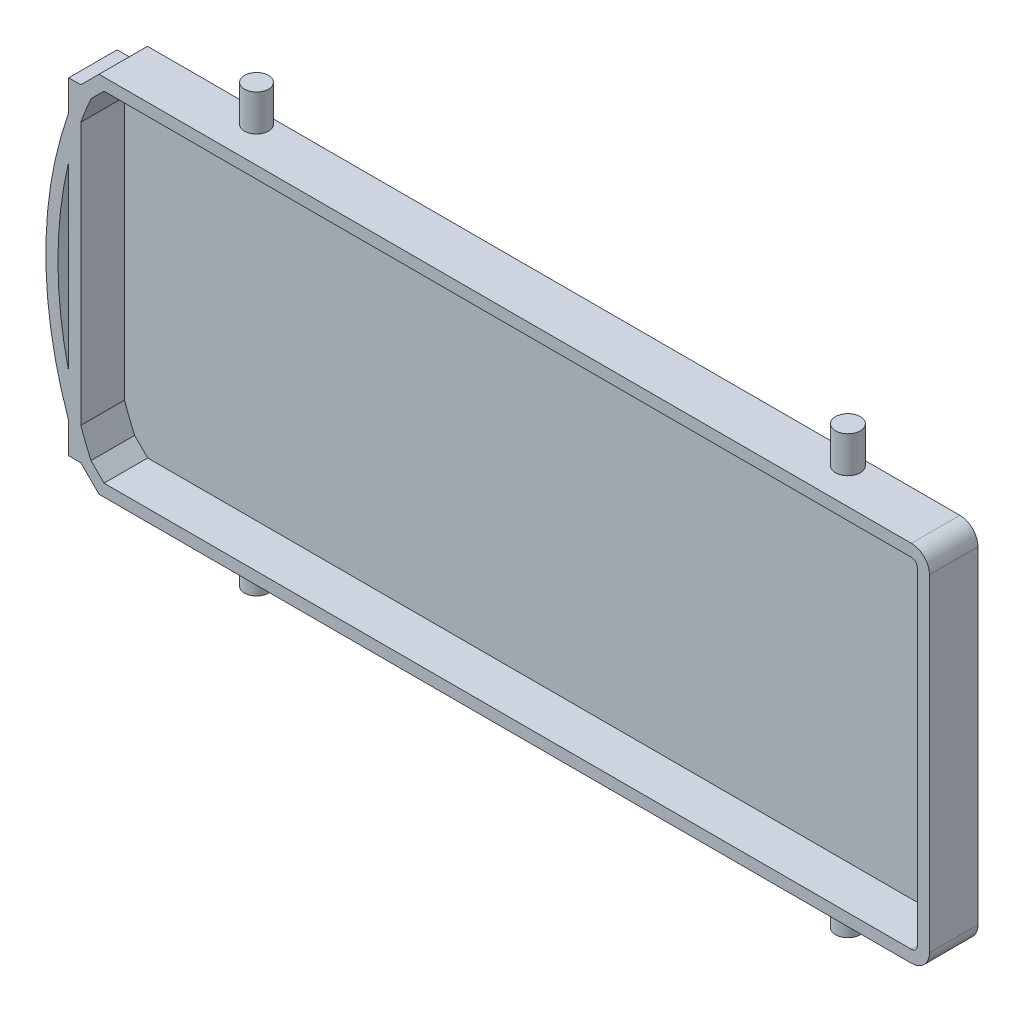
ISO-10303-21;
HEADER;
FILE_DESCRIPTION(('STEP AP214'),'2;1');
FILE_NAME('part.step','',(''),(''),'','','');
FILE_SCHEMA(('AUTOMOTIVE_DESIGN { 1 0 10303 214 1 1 1 1 }'));
ENDSEC;
DATA;
#1=APPLICATION_CONTEXT('core data for automotive mechanical design processes');
#2=APPLICATION_PROTOCOL_DEFINITION('international standard','automotive_design',2000,#1);
#3=PRODUCT_CONTEXT('',#1,'mechanical');
#4=PRODUCT('Part','Part','',(#3));
#5=PRODUCT_RELATED_PRODUCT_CATEGORY('part','',(#4));
#6=PRODUCT_DEFINITION_FORMATION('','',#4);
#7=PRODUCT_DEFINITION_CONTEXT('part definition',#1,'design');
#8=PRODUCT_DEFINITION('design','',#6,#7);
#9=PRODUCT_DEFINITION_SHAPE('','',#8);
#10=(LENGTH_UNIT() NAMED_UNIT(*) SI_UNIT(.MILLI.,.METRE.));
#11=(NAMED_UNIT(*) PLANE_ANGLE_UNIT() SI_UNIT($,.RADIAN.));
#12=(NAMED_UNIT(*) SI_UNIT($,.STERADIAN.) SOLID_ANGLE_UNIT());
#13=UNCERTAINTY_MEASURE_WITH_UNIT(LENGTH_MEASURE(1.E-05),#10,'distance_accuracy_value','');
#14=(GEOMETRIC_REPRESENTATION_CONTEXT(3) GLOBAL_UNCERTAINTY_ASSIGNED_CONTEXT((#13)) GLOBAL_UNIT_ASSIGNED_CONTEXT((#10,
#11,#12)) REPRESENTATION_CONTEXT('',''));
#15=CARTESIAN_POINT('',(0.,0.,0.));
#16=DIRECTION('',(0.,0.,1.));
#17=DIRECTION('',(1.,0.,0.));
#18=AXIS2_PLACEMENT_3D('',#15,#16,#17);
#19=CARTESIAN_POINT('',(-48.8771015017287,0.,40.));
#20=DIRECTION('',(0.,0.,-1.));
#21=DIRECTION('',(-1.,0.,0.));
#22=AXIS2_PLACEMENT_3D('',#19,#20,#21);
#23=CYLINDRICAL_SURFACE('',#22,320.);
#24=DIRECTION('',(0.,0.,-1.));
#25=VECTOR('',#24,1.);
#26=CARTESIAN_POINT('',(-350.,108.282039138538,40.));
#27=LINE('',#26,#25);
#28=CARTESIAN_POINT('',(-350.,108.282039138538,4.));
#29=VERTEX_POINT('',#28);
#30=CARTESIAN_POINT('',(-350.,108.282039138538,40.));
#31=VERTEX_POINT('',#30);
#32=EDGE_CURVE('E342',#29,#31,#27,.F.);
#33=ORIENTED_EDGE('',*,*,#32,.F.);
#34=CARTESIAN_POINT('',(-48.8771015017287,0.,4.));
#35=DIRECTION('',(0.,0.,1.));
#36=DIRECTION('',(1.,0.,0.));
#37=AXIS2_PLACEMENT_3D('',#34,#35,#36);
#38=CIRCLE('',#37,320.);
#39=CARTESIAN_POINT('',(-341.617461171138,129.24040320513,4.));
#40=VERTEX_POINT('',#39);
#41=EDGE_CURVE('E329',#29,#40,#38,.F.);
#42=ORIENTED_EDGE('',*,*,#41,.T.);
#43=DIRECTION('',(0.,0.,-1.));
#44=VECTOR('',#43,1.);
#45=CARTESIAN_POINT('',(-341.617461171139,129.24040320513,40.));
#46=LINE('',#45,#44);
#47=CARTESIAN_POINT('',(-341.617461171139,129.24040320513,40.));
#48=VERTEX_POINT('',#47);
#49=EDGE_CURVE('E192',#48,#40,#46,.T.);
#50=ORIENTED_EDGE('',*,*,#49,.F.);
#51=CARTESIAN_POINT('',(-48.8771015017287,0.,40.));
#52=DIRECTION('',(0.,0.,1.));
#53=DIRECTION('',(1.,0.,0.));
#54=AXIS2_PLACEMENT_3D('',#51,#52,#53);
#55=CIRCLE('',#54,320.);
#56=EDGE_CURVE('E346',#31,#48,#55,.F.);
#57=ORIENTED_EDGE('',*,*,#56,.F.);
#58=EDGE_LOOP('',(#33,#42,#50,#57));
#59=FACE_BOUND('',#58,.T.);
#60=ADVANCED_FACE('F167',(#59),#23,.F.);
#61=CARTESIAN_POINT('',(-234.331213423204,140.,10.7496274782667));
#62=DIRECTION('',(0.,1.,0.));
#63=DIRECTION('',(0.,0.,1.));
#64=AXIS2_PLACEMENT_3D('',#61,#62,#63);
#65=PLANE('',#64);
#66=DIRECTION('',(0.,0.,-1.));
#67=VECTOR('',#66,1.);
#68=CARTESIAN_POINT('',(-330.857864376269,140.,40.));
#69=LINE('',#68,#67);
#70=CARTESIAN_POINT('',(-330.857864376269,140.,40.));
#71=VERTEX_POINT('',#70);
#72=CARTESIAN_POINT('',(-330.857864376269,140.,4.));
#73=VERTEX_POINT('',#72);
#74=EDGE_CURVE('E423',#71,#73,#69,.T.);
#75=ORIENTED_EDGE('',*,*,#74,.T.);
#76=DIRECTION('',(1.,0.,0.));
#77=VECTOR('',#76,1.);
#78=CARTESIAN_POINT('',(-234.331213423204,140.,4.));
#79=LINE('',#78,#77);
#80=CARTESIAN_POINT('',(335.,140.,4.));
#81=VERTEX_POINT('',#80);
#82=EDGE_CURVE('E184',#73,#81,#79,.T.);
#83=ORIENTED_EDGE('',*,*,#82,.T.);
#84=DIRECTION('',(0.,0.,-1.));
#85=VECTOR('',#84,1.);
#86=CARTESIAN_POINT('',(335.,140.,40.));
#87=LINE('',#86,#85);
#88=CARTESIAN_POINT('',(335.,140.,40.));
#89=VERTEX_POINT('',#88);
#90=EDGE_CURVE('E490',#89,#81,#87,.T.);
#91=ORIENTED_EDGE('',*,*,#90,.F.);
#92=DIRECTION('',(1.,0.,0.));
#93=VECTOR('',#92,1.);
#94=CARTESIAN_POINT('',(-335.,140.,40.));
#95=LINE('',#94,#93);
#96=EDGE_CURVE('E457',#71,#89,#95,.T.);
#97=ORIENTED_EDGE('',*,*,#96,.F.);
#98=EDGE_LOOP('',(#75,#83,#91,#97));
#99=FACE_BOUND('',#98,.T.);
#100=ADVANCED_FACE('F606',(#99),#65,.F.);
#101=CARTESIAN_POINT('',(-234.331213423204,180.,10.7496274782667));
#102=DIRECTION('',(0.,-1.,0.));
#103=DIRECTION('',(0.,0.,-1.));
#104=AXIS2_PLACEMENT_3D('',#101,#102,#103);
#105=CYLINDRICAL_SURFACE('',#104,9.87493762328161);
#106=CARTESIAN_POINT('',(-234.331213423204,150.,10.7496274782667));
#107=DIRECTION('',(0.,1.,0.));
#108=DIRECTION('',(0.,0.,1.));
#109=AXIS2_PLACEMENT_3D('',#106,#107,#108);
#110=CIRCLE('',#109,9.87493762328161);
#111=CARTESIAN_POINT('',(-234.331213423204,150.,20.6245651015483));
#112=VERTEX_POINT('',#111);
#113=EDGE_CURVE('E171',#112,#112,#110,.T.);
#114=ORIENTED_EDGE('',*,*,#113,.T.);
#115=EDGE_LOOP('',(#114));
#116=FACE_BOUND('',#115,.T.);
#117=CARTESIAN_POINT('',(-234.331213423204,180.,10.7496274782667));
#118=DIRECTION('',(0.,1.,0.));
#119=DIRECTION('',(0.,0.,1.));
#120=AXIS2_PLACEMENT_3D('',#117,#118,#119);
#121=CIRCLE('',#120,9.87493762328161);
#122=CARTESIAN_POINT('',(-234.331213423204,180.,20.6245651015483));
#123=VERTEX_POINT('',#122);
#124=EDGE_CURVE('E367',#123,#123,#121,.T.);
#125=ORIENTED_EDGE('',*,*,#124,.F.);
#126=EDGE_LOOP('',(#125));
#127=FACE_BOUND('',#126,.T.);
#128=ADVANCED_FACE('F169',(#116,#127),#105,.T.);
#129=CARTESIAN_POINT('',(-234.331213423204,180.,10.7496274782667));
#130=DIRECTION('',(0.,1.,0.));
#131=DIRECTION('',(0.,0.,1.));
#132=AXIS2_PLACEMENT_3D('',#129,#130,#131);
#133=PLANE('',#132);
#134=ORIENTED_EDGE('',*,*,#124,.T.);
#135=EDGE_LOOP('',(#134));
#136=FACE_BOUND('',#135,.T.);
#137=ADVANCED_FACE('F722',(#136),#133,.T.);
#138=CARTESIAN_POINT('',(335.,-135.,0.));
#139=DIRECTION('',(0.,0.,-1.));
#140=DIRECTION('',(-1.,0.,0.));
#141=AXIS2_PLACEMENT_3D('',#138,#139,#140);
#142=PLANE('',#141);
#143=DIRECTION('',(-0.707106781186548,0.707106781186547,0.));
#144=VECTOR('',#143,1.);
#145=CARTESIAN_POINT('',(-350.,-135.,0.));
#146=LINE('',#145,#144);
#147=CARTESIAN_POINT('',(-335.,-150.,0.));
#148=VERTEX_POINT('',#147);
#149=CARTESIAN_POINT('',(-350.,-135.,0.));
#150=VERTEX_POINT('',#149);
#151=EDGE_CURVE('E363',#148,#150,#146,.T.);
#152=ORIENTED_EDGE('',*,*,#151,.T.);
#153=DIRECTION('',(-1.,0.,0.));
#154=VECTOR('',#153,1.);
#155=CARTESIAN_POINT('',(-350.,-135.,0.));
#156=LINE('',#155,#154);
#157=CARTESIAN_POINT('',(-360.,-135.,0.));
#158=VERTEX_POINT('',#157);
#159=EDGE_CURVE('E520',#150,#158,#156,.T.);
#160=ORIENTED_EDGE('',*,*,#159,.T.);
#161=DIRECTION('',(0.,-1.,0.));
#162=VECTOR('',#161,1.);
#163=CARTESIAN_POINT('',(-360.,135.,0.));
#164=LINE('',#163,#162);
#165=CARTESIAN_POINT('',(-360.,-110.011554075173,0.));
#166=VERTEX_POINT('',#165);
#167=EDGE_CURVE('E522',#166,#158,#164,.T.);
#168=ORIENTED_EDGE('',*,*,#167,.F.);
#169=CARTESIAN_POINT('',(-48.8771015017287,0.,0.));
#170=DIRECTION('',(0.,0.,-1.));
#171=DIRECTION('',(-1.,0.,0.));
#172=AXIS2_PLACEMENT_3D('',#169,#170,#171);
#173=CIRCLE('',#172,330.);
#174=CARTESIAN_POINT('',(-360.,110.011554075172,0.));
#175=VERTEX_POINT('',#174);
#176=EDGE_CURVE('E536',#166,#175,#173,.T.);
#177=ORIENTED_EDGE('',*,*,#176,.T.);
#178=CARTESIAN_POINT('',(-360.,135.,0.));
#179=VERTEX_POINT('',#178);
#180=EDGE_CURVE('E517',#179,#175,#164,.T.);
#181=ORIENTED_EDGE('',*,*,#180,.F.);
#182=DIRECTION('',(1.,0.,0.));
#183=VECTOR('',#182,1.);
#184=CARTESIAN_POINT('',(-360.,135.,0.));
#185=LINE('',#184,#183);
#186=CARTESIAN_POINT('',(-350.,135.,0.));
#187=VERTEX_POINT('',#186);
#188=EDGE_CURVE('E410',#179,#187,#185,.T.);
#189=ORIENTED_EDGE('',*,*,#188,.T.);
#190=DIRECTION('',(0.707106781186548,0.707106781186547,0.));
#191=VECTOR('',#190,1.);
#192=CARTESIAN_POINT('',(-350.,135.,0.));
#193=LINE('',#192,#191);
#194=CARTESIAN_POINT('',(-335.,150.,0.));
#195=VERTEX_POINT('',#194);
#196=EDGE_CURVE('E404',#187,#195,#193,.T.);
#197=ORIENTED_EDGE('',*,*,#196,.T.);
#198=DIRECTION('',(1.,0.,0.));
#199=VECTOR('',#198,1.);
#200=CARTESIAN_POINT('',(-335.,150.,0.));
#201=LINE('',#200,#199);
#202=CARTESIAN_POINT('',(335.,150.,0.));
#203=VERTEX_POINT('',#202);
#204=EDGE_CURVE('E390',#195,#203,#201,.T.);
#205=ORIENTED_EDGE('',*,*,#204,.T.);
#206=CARTESIAN_POINT('',(335.,135.,0.));
#207=DIRECTION('',(0.,0.,-1.));
#208=DIRECTION('',(-1.,0.,0.));
#209=AXIS2_PLACEMENT_3D('',#206,#207,#208);
#210=CIRCLE('',#209,15.);
#211=CARTESIAN_POINT('',(350.,135.,0.));
#212=VERTEX_POINT('',#211);
#213=EDGE_CURVE('E400',#203,#212,#210,.T.);
#214=ORIENTED_EDGE('',*,*,#213,.T.);
#215=DIRECTION('',(0.,-1.,0.));
#216=VECTOR('',#215,1.);
#217=CARTESIAN_POINT('',(350.,135.,0.));
#218=LINE('',#217,#216);
#219=CARTESIAN_POINT('',(350.,-135.,0.));
#220=VERTEX_POINT('',#219);
#221=EDGE_CURVE('E475',#212,#220,#218,.T.);
#222=ORIENTED_EDGE('',*,*,#221,.T.);
#223=CARTESIAN_POINT('',(335.,-135.,0.));
#224=DIRECTION('',(0.,0.,-1.));
#225=DIRECTION('',(1.,0.,0.));
#226=AXIS2_PLACEMENT_3D('',#223,#224,#225);
#227=CIRCLE('',#226,15.);
#228=CARTESIAN_POINT('',(335.,-150.,0.));
#229=VERTEX_POINT('',#228);
#230=EDGE_CURVE('E472',#220,#229,#227,.T.);
#231=ORIENTED_EDGE('',*,*,#230,.T.);
#232=DIRECTION('',(-1.,0.,0.));
#233=VECTOR('',#232,1.);
#234=CARTESIAN_POINT('',(-335.,-150.,0.));
#235=LINE('',#234,#233);
#236=EDGE_CURVE('E469',#229,#148,#235,.T.);
#237=ORIENTED_EDGE('',*,*,#236,.T.);
#238=EDGE_LOOP('',(#152,#160,#168,#177,#181,#189,#197,#205,#214,#222,#231,#237));
#239=FACE_BOUND('',#238,.T.);
#240=CARTESIAN_POINT('',(-48.8771015017287,0.,0.));
#241=DIRECTION('',(0.,0.,1.));
#242=DIRECTION('',(1.,0.,0.));
#243=AXIS2_PLACEMENT_3D('',#240,#241,#242);
#244=CIRCLE('',#243,320.);
#245=CARTESIAN_POINT('',(-360.,-74.8501304610392,0.));
#246=VERTEX_POINT('',#245);
#247=CARTESIAN_POINT('',(-360.,74.8501304610388,0.));
#248=VERTEX_POINT('',#247);
#249=EDGE_CURVE('E437',#246,#248,#244,.F.);
#250=ORIENTED_EDGE('',*,*,#249,.F.);
#251=EDGE_CURVE('E521',#248,#246,#164,.T.);
#252=ORIENTED_EDGE('',*,*,#251,.F.);
#253=EDGE_LOOP('',(#250,#252));
#254=FACE_BOUND('',#253,.T.);
#255=ADVANCED_FACE('F406',(#239,#254),#142,.T.);
#256=CARTESIAN_POINT('',(335.,-135.,40.));
#257=DIRECTION('',(0.,0.,-1.));
#258=DIRECTION('',(-1.,0.,0.));
#259=AXIS2_PLACEMENT_3D('',#256,#257,#258);
#260=PLANE('',#259);
#261=DIRECTION('',(-0.707106781186548,0.707106781186547,0.));
#262=VECTOR('',#261,1.);
#263=CARTESIAN_POINT('',(-342.928932188134,-127.928932188134,40.));
#264=LINE('',#263,#262);
#265=CARTESIAN_POINT('',(-330.857864376269,-140.,40.));
#266=VERTEX_POINT('',#265);
#267=CARTESIAN_POINT('',(-341.617461171139,-129.24040320513,40.));
#268=VERTEX_POINT('',#267);
#269=EDGE_CURVE('E399',#266,#268,#264,.T.);
#270=ORIENTED_EDGE('',*,*,#269,.T.);
#271=CARTESIAN_POINT('',(-350.,-108.282039138539,40.));
#272=VERTEX_POINT('',#271);
#273=EDGE_CURVE('E528',#268,#272,#55,.F.);
#274=ORIENTED_EDGE('',*,*,#273,.T.);
#275=DIRECTION('',(0.,-1.,0.));
#276=VECTOR('',#275,1.);
#277=CARTESIAN_POINT('',(-350.,135.,40.));
#278=LINE('',#277,#276);
#279=EDGE_CURVE('E512',#31,#272,#278,.T.);
#280=ORIENTED_EDGE('',*,*,#279,.F.);
#281=ORIENTED_EDGE('',*,*,#56,.T.);
#282=DIRECTION('',(0.707106781186548,0.707106781186547,0.));
#283=VECTOR('',#282,1.);
#284=CARTESIAN_POINT('',(-342.928932188135,127.928932188134,40.));
#285=LINE('',#284,#283);
#286=EDGE_CURVE('E417',#48,#71,#285,.T.);
#287=ORIENTED_EDGE('',*,*,#286,.T.);
#288=ORIENTED_EDGE('',*,*,#96,.T.);
#289=CARTESIAN_POINT('',(335.,135.,40.));
#290=DIRECTION('',(0.,0.,1.));
#291=DIRECTION('',(1.,0.,0.));
#292=AXIS2_PLACEMENT_3D('',#289,#290,#291);
#293=CIRCLE('',#292,5.);
#294=CARTESIAN_POINT('',(340.,135.,40.));
#295=VERTEX_POINT('',#294);
#296=EDGE_CURVE('E459',#89,#295,#293,.F.);
#297=ORIENTED_EDGE('',*,*,#296,.T.);
#298=DIRECTION('',(0.,-1.,0.));
#299=VECTOR('',#298,1.);
#300=CARTESIAN_POINT('',(340.,135.,40.));
#301=LINE('',#300,#299);
#302=CARTESIAN_POINT('',(340.,-135.,40.));
#303=VERTEX_POINT('',#302);
#304=EDGE_CURVE('E461',#295,#303,#301,.T.);
#305=ORIENTED_EDGE('',*,*,#304,.T.);
#306=CARTESIAN_POINT('',(335.,-135.,40.));
#307=DIRECTION('',(0.,0.,1.));
#308=DIRECTION('',(1.,0.,0.));
#309=AXIS2_PLACEMENT_3D('',#306,#307,#308);
#310=CIRCLE('',#309,5.);
#311=CARTESIAN_POINT('',(335.,-140.,40.));
#312=VERTEX_POINT('',#311);
#313=EDGE_CURVE('E463',#303,#312,#310,.F.);
#314=ORIENTED_EDGE('',*,*,#313,.T.);
#315=DIRECTION('',(1.,0.,0.));
#316=VECTOR('',#315,1.);
#317=CARTESIAN_POINT('',(-335.,-140.,40.));
#318=LINE('',#317,#316);
#319=EDGE_CURVE('E465',#312,#266,#318,.F.);
#320=ORIENTED_EDGE('',*,*,#319,.T.);
#321=EDGE_LOOP('',(#270,#274,#280,#281,#287,#288,#297,#305,#314,#320));
#322=FACE_BOUND('',#321,.T.);
#323=DIRECTION('',(0.707106781186548,0.707106781186547,0.));
#324=VECTOR('',#323,1.);
#325=CARTESIAN_POINT('',(-350.,135.,40.));
#326=LINE('',#325,#324);
#327=CARTESIAN_POINT('',(-350.,135.,40.));
#328=VERTEX_POINT('',#327);
#329=CARTESIAN_POINT('',(-335.,150.,40.));
#330=VERTEX_POINT('',#329);
#331=EDGE_CURVE('E413',#328,#330,#326,.T.);
#332=ORIENTED_EDGE('',*,*,#331,.F.);
#333=DIRECTION('',(1.,0.,0.));
#334=VECTOR('',#333,1.);
#335=CARTESIAN_POINT('',(-360.,135.,40.));
#336=LINE('',#335,#334);
#337=CARTESIAN_POINT('',(-360.,135.,40.));
#338=VERTEX_POINT('',#337);
#339=EDGE_CURVE('E514',#338,#328,#336,.T.);
#340=ORIENTED_EDGE('',*,*,#339,.F.);
#341=DIRECTION('',(0.,-1.,0.));
#342=VECTOR('',#341,1.);
#343=CARTESIAN_POINT('',(-360.,135.,40.));
#344=LINE('',#343,#342);
#345=CARTESIAN_POINT('',(-360.,110.011554075172,40.));
#346=VERTEX_POINT('',#345);
#347=EDGE_CURVE('E504',#338,#346,#344,.T.);
#348=ORIENTED_EDGE('',*,*,#347,.T.);
#349=CARTESIAN_POINT('',(-48.8771015017287,0.,40.));
#350=DIRECTION('',(0.,0.,-1.));
#351=DIRECTION('',(-1.,0.,0.));
#352=AXIS2_PLACEMENT_3D('',#349,#350,#351);
#353=CIRCLE('',#352,330.);
#354=CARTESIAN_POINT('',(-360.,-110.011554075173,40.));
#355=VERTEX_POINT('',#354);
#356=EDGE_CURVE('E530',#355,#346,#353,.T.);
#357=ORIENTED_EDGE('',*,*,#356,.F.);
#358=CARTESIAN_POINT('',(-360.,-135.,40.));
#359=VERTEX_POINT('',#358);
#360=EDGE_CURVE('E509',#355,#359,#344,.T.);
#361=ORIENTED_EDGE('',*,*,#360,.T.);
#362=DIRECTION('',(-1.,0.,0.));
#363=VECTOR('',#362,1.);
#364=CARTESIAN_POINT('',(-350.,-135.,40.));
#365=LINE('',#364,#363);
#366=CARTESIAN_POINT('',(-350.,-135.,40.));
#367=VERTEX_POINT('',#366);
#368=EDGE_CURVE('E507',#367,#359,#365,.T.);
#369=ORIENTED_EDGE('',*,*,#368,.F.);
#370=DIRECTION('',(-0.707106781186548,0.707106781186547,0.));
#371=VECTOR('',#370,1.);
#372=CARTESIAN_POINT('',(-350.,-135.,40.));
#373=LINE('',#372,#371);
#374=CARTESIAN_POINT('',(-335.,-150.,40.));
#375=VERTEX_POINT('',#374);
#376=EDGE_CURVE('E440',#375,#367,#373,.T.);
#377=ORIENTED_EDGE('',*,*,#376,.F.);
#378=DIRECTION('',(-1.,0.,0.));
#379=VECTOR('',#378,1.);
#380=CARTESIAN_POINT('',(-335.,-150.,40.));
#381=LINE('',#380,#379);
#382=CARTESIAN_POINT('',(335.,-150.,40.));
#383=VERTEX_POINT('',#382);
#384=EDGE_CURVE('E443',#383,#375,#381,.T.);
#385=ORIENTED_EDGE('',*,*,#384,.F.);
#386=CARTESIAN_POINT('',(335.,-135.,40.));
#387=DIRECTION('',(0.,0.,-1.));
#388=DIRECTION('',(1.,0.,0.));
#389=AXIS2_PLACEMENT_3D('',#386,#387,#388);
#390=CIRCLE('',#389,15.);
#391=CARTESIAN_POINT('',(350.,-135.,40.));
#392=VERTEX_POINT('',#391);
#393=EDGE_CURVE('E446',#392,#383,#390,.T.);
#394=ORIENTED_EDGE('',*,*,#393,.F.);
#395=DIRECTION('',(0.,-1.,0.));
#396=VECTOR('',#395,1.);
#397=CARTESIAN_POINT('',(350.,135.,40.));
#398=LINE('',#397,#396);
#399=CARTESIAN_POINT('',(350.,135.,40.));
#400=VERTEX_POINT('',#399);
#401=EDGE_CURVE('E449',#400,#392,#398,.T.);
#402=ORIENTED_EDGE('',*,*,#401,.F.);
#403=CARTESIAN_POINT('',(335.,135.,40.));
#404=DIRECTION('',(0.,0.,-1.));
#405=DIRECTION('',(-1.,0.,0.));
#406=AXIS2_PLACEMENT_3D('',#403,#404,#405);
#407=CIRCLE('',#406,15.);
#408=CARTESIAN_POINT('',(335.,150.,40.));
#409=VERTEX_POINT('',#408);
#410=EDGE_CURVE('E452',#409,#400,#407,.T.);
#411=ORIENTED_EDGE('',*,*,#410,.F.);
#412=DIRECTION('',(1.,0.,0.));
#413=VECTOR('',#412,1.);
#414=CARTESIAN_POINT('',(-335.,150.,40.));
#415=LINE('',#414,#413);
#416=EDGE_CURVE('E455',#330,#409,#415,.T.);
#417=ORIENTED_EDGE('',*,*,#416,.F.);
#418=EDGE_LOOP('',(#332,#340,#348,#357,#361,#369,#377,#385,#394,#402,#411,#417));
#419=FACE_BOUND('',#418,.T.);
#420=CARTESIAN_POINT('',(-360.,74.8501304610388,40.));
#421=VERTEX_POINT('',#420);
#422=CARTESIAN_POINT('',(-360.,-74.8501304610392,40.));
#423=VERTEX_POINT('',#422);
#424=EDGE_CURVE('E508',#421,#423,#344,.T.);
#425=ORIENTED_EDGE('',*,*,#424,.T.);
#426=EDGE_CURVE('E531',#423,#421,#55,.F.);
#427=ORIENTED_EDGE('',*,*,#426,.T.);
#428=EDGE_LOOP('',(#425,#427));
#429=FACE_BOUND('',#428,.T.);
#430=ADVANCED_FACE('F562',(#322,#419,#429),#260,.F.);
#431=CARTESIAN_POINT('',(-350.,-135.,40.));
#432=DIRECTION('',(-0.707106781186547,-0.707106781186548,0.));
#433=DIRECTION('',(0.707106781186548,-0.707106781186547,0.));
#434=AXIS2_PLACEMENT_3D('',#431,#432,#433);
#435=PLANE('',#434);
#436=DIRECTION('',(0.,0.,-1.));
#437=VECTOR('',#436,1.);
#438=CARTESIAN_POINT('',(-350.,-135.,40.));
#439=LINE('',#438,#437);
#440=EDGE_CURVE('E366',#367,#150,#439,.T.);
#441=ORIENTED_EDGE('',*,*,#440,.T.);
#442=ORIENTED_EDGE('',*,*,#151,.F.);
#443=DIRECTION('',(0.,0.,-1.));
#444=VECTOR('',#443,1.);
#445=CARTESIAN_POINT('',(-335.,-150.,40.));
#446=LINE('',#445,#444);
#447=EDGE_CURVE('E501',#375,#148,#446,.T.);
#448=ORIENTED_EDGE('',*,*,#447,.F.);
#449=ORIENTED_EDGE('',*,*,#376,.T.);
#450=EDGE_LOOP('',(#441,#442,#448,#449));
#451=FACE_BOUND('',#450,.T.);
#452=ADVANCED_FACE('F571',(#451),#435,.T.);
#453=CARTESIAN_POINT('',(-335.,-150.,40.));
#454=DIRECTION('',(0.,-1.,0.));
#455=DIRECTION('',(0.,0.,-1.));
#456=AXIS2_PLACEMENT_3D('',#453,#454,#455);
#457=PLANE('',#456);
#458=CARTESIAN_POINT('',(253.43138621595,-150.,10.7496274782667));
#459=DIRECTION('',(0.,-1.,0.));
#460=DIRECTION('',(0.,0.,-1.));
#461=AXIS2_PLACEMENT_3D('',#458,#459,#460);
#462=CIRCLE('',#461,10.1816899665718);
#463=CARTESIAN_POINT('',(253.43138621595,-150.,0.567937511694957));
#464=VERTEX_POINT('',#463);
#465=EDGE_CURVE('E12',#464,#464,#462,.T.);
#466=ORIENTED_EDGE('',*,*,#465,.F.);
#467=EDGE_LOOP('',(#466));
#468=FACE_BOUND('',#467,.T.);
#469=CARTESIAN_POINT('',(-234.331213423204,-150.,10.7496274782667));
#470=DIRECTION('',(0.,-1.,0.));
#471=DIRECTION('',(0.,0.,-1.));
#472=AXIS2_PLACEMENT_3D('',#469,#470,#471);
#473=CIRCLE('',#472,9.87493762328161);
#474=CARTESIAN_POINT('',(-234.331213423204,-150.,0.874689854985103));
#475=VERTEX_POINT('',#474);
#476=EDGE_CURVE('E176',#475,#475,#473,.T.);
#477=ORIENTED_EDGE('',*,*,#476,.F.);
#478=EDGE_LOOP('',(#477));
#479=FACE_BOUND('',#478,.T.);
#480=ORIENTED_EDGE('',*,*,#236,.F.);
#481=DIRECTION('',(0.,0.,-1.));
#482=VECTOR('',#481,1.);
#483=CARTESIAN_POINT('',(335.,-150.,40.));
#484=LINE('',#483,#482);
#485=EDGE_CURVE('E499',#383,#229,#484,.T.);
#486=ORIENTED_EDGE('',*,*,#485,.F.);
#487=ORIENTED_EDGE('',*,*,#384,.T.);
#488=ORIENTED_EDGE('',*,*,#447,.T.);
#489=EDGE_LOOP('',(#480,#486,#487,#488));
#490=FACE_BOUND('',#489,.T.);
#491=ADVANCED_FACE('F576',(#468,#479,#490),#457,.T.);
#492=CARTESIAN_POINT('',(335.,-135.,40.));
#493=DIRECTION('',(0.,0.,-1.));
#494=DIRECTION('',(-1.,0.,0.));
#495=AXIS2_PLACEMENT_3D('',#492,#493,#494);
#496=CYLINDRICAL_SURFACE('',#495,15.);
#497=ORIENTED_EDGE('',*,*,#485,.T.);
#498=ORIENTED_EDGE('',*,*,#230,.F.);
#499=DIRECTION('',(0.,0.,-1.));
#500=VECTOR('',#499,1.);
#501=CARTESIAN_POINT('',(350.,-135.,40.));
#502=LINE('',#501,#500);
#503=EDGE_CURVE('E497',#392,#220,#502,.T.);
#504=ORIENTED_EDGE('',*,*,#503,.F.);
#505=ORIENTED_EDGE('',*,*,#393,.T.);
#506=EDGE_LOOP('',(#497,#498,#504,#505));
#507=FACE_BOUND('',#506,.T.);
#508=ADVANCED_FACE('F579',(#507),#496,.T.);
#509=CARTESIAN_POINT('',(350.,135.,40.));
#510=DIRECTION('',(1.,0.,0.));
#511=DIRECTION('',(0.,1.,0.));
#512=AXIS2_PLACEMENT_3D('',#509,#510,#511);
#513=PLANE('',#512);
#514=ORIENTED_EDGE('',*,*,#503,.T.);
#515=ORIENTED_EDGE('',*,*,#221,.F.);
#516=DIRECTION('',(0.,0.,-1.));
#517=VECTOR('',#516,1.);
#518=CARTESIAN_POINT('',(350.,135.,40.));
#519=LINE('',#518,#517);
#520=EDGE_CURVE('E495',#400,#212,#519,.T.);
#521=ORIENTED_EDGE('',*,*,#520,.F.);
#522=ORIENTED_EDGE('',*,*,#401,.T.);
#523=EDGE_LOOP('',(#514,#515,#521,#522));
#524=FACE_BOUND('',#523,.T.);
#525=ADVANCED_FACE('F583',(#524),#513,.T.);
#526=CARTESIAN_POINT('',(335.,135.,40.));
#527=DIRECTION('',(0.,0.,-1.));
#528=DIRECTION('',(-1.,0.,0.));
#529=AXIS2_PLACEMENT_3D('',#526,#527,#528);
#530=CYLINDRICAL_SURFACE('',#529,15.);
#531=ORIENTED_EDGE('',*,*,#520,.T.);
#532=ORIENTED_EDGE('',*,*,#213,.F.);
#533=DIRECTION('',(0.,0.,-1.));
#534=VECTOR('',#533,1.);
#535=CARTESIAN_POINT('',(335.,150.,40.));
#536=LINE('',#535,#534);
#537=EDGE_CURVE('E395',#409,#203,#536,.T.);
#538=ORIENTED_EDGE('',*,*,#537,.F.);
#539=ORIENTED_EDGE('',*,*,#410,.T.);
#540=EDGE_LOOP('',(#531,#532,#538,#539));
#541=FACE_BOUND('',#540,.T.);
#542=ADVANCED_FACE('F382',(#541),#530,.T.);
#543=CARTESIAN_POINT('',(-335.,150.,40.));
#544=DIRECTION('',(0.,1.,0.));
#545=DIRECTION('',(0.,0.,1.));
#546=AXIS2_PLACEMENT_3D('',#543,#544,#545);
#547=PLANE('',#546);
#548=ORIENTED_EDGE('',*,*,#113,.F.);
#549=EDGE_LOOP('',(#548));
#550=FACE_BOUND('',#549,.T.);
#551=CARTESIAN_POINT('',(253.43138621595,150.,10.7496274782667));
#552=DIRECTION('',(0.,1.,0.));
#553=DIRECTION('',(0.,0.,1.));
#554=AXIS2_PLACEMENT_3D('',#551,#552,#553);
#555=CIRCLE('',#554,10.1816899665718);
#556=CARTESIAN_POINT('',(253.43138621595,150.,20.9313174448385));
#557=VERTEX_POINT('',#556);
#558=EDGE_CURVE('E387',#557,#557,#555,.F.);
#559=ORIENTED_EDGE('',*,*,#558,.T.);
#560=EDGE_LOOP('',(#559));
#561=FACE_BOUND('',#560,.T.);
#562=ORIENTED_EDGE('',*,*,#204,.F.);
#563=DIRECTION('',(0.,0.,-1.));
#564=VECTOR('',#563,1.);
#565=CARTESIAN_POINT('',(-335.,150.,40.));
#566=LINE('',#565,#564);
#567=EDGE_CURVE('E393',#330,#195,#566,.T.);
#568=ORIENTED_EDGE('',*,*,#567,.F.);
#569=ORIENTED_EDGE('',*,*,#416,.T.);
#570=ORIENTED_EDGE('',*,*,#537,.T.);
#571=EDGE_LOOP('',(#562,#568,#569,#570));
#572=FACE_BOUND('',#571,.T.);
#573=ADVANCED_FACE('F378',(#550,#561,#572),#547,.T.);
#574=CARTESIAN_POINT('',(335.,135.,40.));
#575=DIRECTION('',(0.,0.,-1.));
#576=DIRECTION('',(-1.,0.,0.));
#577=AXIS2_PLACEMENT_3D('',#574,#575,#576);
#578=CYLINDRICAL_SURFACE('',#577,5.);
#579=ORIENTED_EDGE('',*,*,#90,.T.);
#580=CARTESIAN_POINT('',(335.,135.,4.));
#581=DIRECTION('',(0.,0.,1.));
#582=DIRECTION('',(1.,0.,0.));
#583=AXIS2_PLACEMENT_3D('',#580,#581,#582);
#584=CIRCLE('',#583,5.);
#585=CARTESIAN_POINT('',(340.,135.,4.));
#586=VERTEX_POINT('',#585);
#587=EDGE_CURVE('E336',#81,#586,#584,.F.);
#588=ORIENTED_EDGE('',*,*,#587,.T.);
#589=DIRECTION('',(0.,0.,-1.));
#590=VECTOR('',#589,1.);
#591=CARTESIAN_POINT('',(340.,135.,40.));
#592=LINE('',#591,#590);
#593=EDGE_CURVE('E487',#295,#586,#592,.T.);
#594=ORIENTED_EDGE('',*,*,#593,.F.);
#595=ORIENTED_EDGE('',*,*,#296,.F.);
#596=EDGE_LOOP('',(#579,#588,#594,#595));
#597=FACE_BOUND('',#596,.T.);
#598=ADVANCED_FACE('F381',(#597),#578,.F.);
#599=CARTESIAN_POINT('',(340.,135.,40.));
#600=DIRECTION('',(1.,0.,0.));
#601=DIRECTION('',(0.,1.,0.));
#602=AXIS2_PLACEMENT_3D('',#599,#600,#601);
#603=PLANE('',#602);
#604=ORIENTED_EDGE('',*,*,#593,.T.);
#605=DIRECTION('',(0.,-1.,0.));
#606=VECTOR('',#605,1.);
#607=CARTESIAN_POINT('',(340.,135.,4.));
#608=LINE('',#607,#606);
#609=CARTESIAN_POINT('',(340.,-135.,4.));
#610=VERTEX_POINT('',#609);
#611=EDGE_CURVE('E918',#586,#610,#608,.T.);
#612=ORIENTED_EDGE('',*,*,#611,.T.);
#613=DIRECTION('',(0.,0.,-1.));
#614=VECTOR('',#613,1.);
#615=CARTESIAN_POINT('',(340.,-135.,40.));
#616=LINE('',#615,#614);
#617=EDGE_CURVE('E484',#303,#610,#616,.T.);
#618=ORIENTED_EDGE('',*,*,#617,.F.);
#619=ORIENTED_EDGE('',*,*,#304,.F.);
#620=EDGE_LOOP('',(#604,#612,#618,#619));
#621=FACE_BOUND('',#620,.T.);
#622=ADVANCED_FACE('F788',(#621),#603,.F.);
#623=CARTESIAN_POINT('',(335.,-135.,40.));
#624=DIRECTION('',(0.,0.,-1.));
#625=DIRECTION('',(-1.,0.,0.));
#626=AXIS2_PLACEMENT_3D('',#623,#624,#625);
#627=CYLINDRICAL_SURFACE('',#626,5.);
#628=ORIENTED_EDGE('',*,*,#617,.T.);
#629=CARTESIAN_POINT('',(335.,-135.,4.));
#630=DIRECTION('',(0.,0.,1.));
#631=DIRECTION('',(1.,0.,0.));
#632=AXIS2_PLACEMENT_3D('',#629,#630,#631);
#633=CIRCLE('',#632,5.);
#634=CARTESIAN_POINT('',(335.,-140.,4.));
#635=VERTEX_POINT('',#634);
#636=EDGE_CURVE('E921',#610,#635,#633,.F.);
#637=ORIENTED_EDGE('',*,*,#636,.T.);
#638=DIRECTION('',(0.,0.,-1.));
#639=VECTOR('',#638,1.);
#640=CARTESIAN_POINT('',(335.,-140.,40.));
#641=LINE('',#640,#639);
#642=EDGE_CURVE('E481',#312,#635,#641,.T.);
#643=ORIENTED_EDGE('',*,*,#642,.F.);
#644=ORIENTED_EDGE('',*,*,#313,.F.);
#645=EDGE_LOOP('',(#628,#637,#643,#644));
#646=FACE_BOUND('',#645,.T.);
#647=ADVANCED_FACE('F630',(#646),#627,.F.);
#648=CARTESIAN_POINT('',(-335.,-140.,40.));
#649=DIRECTION('',(0.,-1.,0.));
#650=DIRECTION('',(0.,0.,-1.));
#651=AXIS2_PLACEMENT_3D('',#648,#649,#650);
#652=PLANE('',#651);
#653=ORIENTED_EDGE('',*,*,#642,.T.);
#654=DIRECTION('',(-1.,0.,0.));
#655=VECTOR('',#654,1.);
#656=CARTESIAN_POINT('',(-335.,-140.,4.));
#657=LINE('',#656,#655);
#658=CARTESIAN_POINT('',(-330.857864376269,-140.,4.));
#659=VERTEX_POINT('',#658);
#660=EDGE_CURVE('E923',#635,#659,#657,.T.);
#661=ORIENTED_EDGE('',*,*,#660,.T.);
#662=DIRECTION('',(0.,0.,-1.));
#663=VECTOR('',#662,1.);
#664=CARTESIAN_POINT('',(-330.857864376269,-140.,40.));
#665=LINE('',#664,#663);
#666=EDGE_CURVE('E467',#266,#659,#665,.T.);
#667=ORIENTED_EDGE('',*,*,#666,.F.);
#668=ORIENTED_EDGE('',*,*,#319,.F.);
#669=EDGE_LOOP('',(#653,#661,#667,#668));
#670=FACE_BOUND('',#669,.T.);
#671=ADVANCED_FACE('F624',(#670),#652,.F.);
#672=CARTESIAN_POINT('',(-342.928932188134,-127.928932188134,40.));
#673=DIRECTION('',(-0.707106781186547,-0.707106781186548,0.));
#674=DIRECTION('',(0.707106781186548,-0.707106781186547,0.));
#675=AXIS2_PLACEMENT_3D('',#672,#673,#674);
#676=PLANE('',#675);
#677=ORIENTED_EDGE('',*,*,#666,.T.);
#678=DIRECTION('',(-0.707106781186548,0.707106781186547,0.));
#679=VECTOR('',#678,1.);
#680=CARTESIAN_POINT('',(-342.928932188134,-127.928932188134,4.));
#681=LINE('',#680,#679);
#682=CARTESIAN_POINT('',(-341.617461171139,-129.24040320513,4.));
#683=VERTEX_POINT('',#682);
#684=EDGE_CURVE('E419',#659,#683,#681,.T.);
#685=ORIENTED_EDGE('',*,*,#684,.T.);
#686=DIRECTION('',(0.,0.,-1.));
#687=VECTOR('',#686,1.);
#688=CARTESIAN_POINT('',(-341.617461171139,-129.24040320513,40.));
#689=LINE('',#688,#687);
#690=EDGE_CURVE('E364',#268,#683,#689,.T.);
#691=ORIENTED_EDGE('',*,*,#690,.F.);
#692=ORIENTED_EDGE('',*,*,#269,.F.);
#693=EDGE_LOOP('',(#677,#685,#691,#692));
#694=FACE_BOUND('',#693,.T.);
#695=ADVANCED_FACE('F599',(#694),#676,.F.);
#696=CARTESIAN_POINT('',(-360.,135.,40.));
#697=DIRECTION('',(0.,1.,0.));
#698=DIRECTION('',(0.,0.,1.));
#699=AXIS2_PLACEMENT_3D('',#696,#697,#698);
#700=PLANE('',#699);
#701=ORIENTED_EDGE('',*,*,#188,.F.);
#702=DIRECTION('',(0.,0.,-1.));
#703=VECTOR('',#702,1.);
#704=CARTESIAN_POINT('',(-360.,135.,40.));
#705=LINE('',#704,#703);
#706=EDGE_CURVE('E516',#338,#179,#705,.T.);
#707=ORIENTED_EDGE('',*,*,#706,.F.);
#708=ORIENTED_EDGE('',*,*,#339,.T.);
#709=DIRECTION('',(0.,0.,-1.));
#710=VECTOR('',#709,1.);
#711=CARTESIAN_POINT('',(-350.,135.,40.));
#712=LINE('',#711,#710);
#713=EDGE_CURVE('E353',#328,#187,#712,.T.);
#714=ORIENTED_EDGE('',*,*,#713,.T.);
#715=EDGE_LOOP('',(#701,#707,#708,#714));
#716=FACE_BOUND('',#715,.T.);
#717=ADVANCED_FACE('F589',(#716),#700,.T.);
#718=CARTESIAN_POINT('',(-360.,135.,40.));
#719=DIRECTION('',(1.,0.,0.));
#720=DIRECTION('',(0.,1.,0.));
#721=AXIS2_PLACEMENT_3D('',#718,#719,#720);
#722=PLANE('',#721);
#723=ORIENTED_EDGE('',*,*,#180,.T.);
#724=DIRECTION('',(0.,0.,-1.));
#725=VECTOR('',#724,1.);
#726=CARTESIAN_POINT('',(-360.,110.011554075172,40.));
#727=LINE('',#726,#725);
#728=EDGE_CURVE('E350',#175,#346,#727,.F.);
#729=ORIENTED_EDGE('',*,*,#728,.T.);
#730=ORIENTED_EDGE('',*,*,#347,.F.);
#731=ORIENTED_EDGE('',*,*,#706,.T.);
#732=EDGE_LOOP('',(#723,#729,#730,#731));
#733=FACE_BOUND('',#732,.T.);
#734=ADVANCED_FACE('F590',(#733),#722,.F.);
#735=ORIENTED_EDGE('',*,*,#426,.F.);
#736=DIRECTION('',(0.,0.,-1.));
#737=VECTOR('',#736,1.);
#738=CARTESIAN_POINT('',(-360.,-74.8501304610392,40.));
#739=LINE('',#738,#737);
#740=EDGE_CURVE('E361',#423,#246,#739,.T.);
#741=ORIENTED_EDGE('',*,*,#740,.T.);
#742=ORIENTED_EDGE('',*,*,#249,.T.);
#743=DIRECTION('',(0.,0.,-1.));
#744=VECTOR('',#743,1.);
#745=CARTESIAN_POINT('',(-360.,74.8501304610388,40.));
#746=LINE('',#745,#744);
#747=EDGE_CURVE('E359',#248,#421,#746,.F.);
#748=ORIENTED_EDGE('',*,*,#747,.T.);
#749=EDGE_LOOP('',(#735,#741,#742,#748));
#750=FACE_BOUND('',#749,.T.);
#751=ADVANCED_FACE('F558',(#750),#23,.F.);
#752=ORIENTED_EDGE('',*,*,#740,.F.);
#753=ORIENTED_EDGE('',*,*,#424,.F.);
#754=ORIENTED_EDGE('',*,*,#747,.F.);
#755=ORIENTED_EDGE('',*,*,#251,.T.);
#756=EDGE_LOOP('',(#752,#753,#754,#755));
#757=FACE_BOUND('',#756,.T.);
#758=ADVANCED_FACE('F553',(#757),#722,.F.);
#759=CARTESIAN_POINT('',(-48.8771015017287,0.,40.));
#760=DIRECTION('',(0.,0.,-1.));
#761=DIRECTION('',(-1.,0.,0.));
#762=AXIS2_PLACEMENT_3D('',#759,#760,#761);
#763=CYLINDRICAL_SURFACE('',#762,330.);
#764=DIRECTION('',(0.,0.,-1.));
#765=VECTOR('',#764,1.);
#766=CARTESIAN_POINT('',(-360.,-110.011554075173,40.));
#767=LINE('',#766,#765);
#768=EDGE_CURVE('E356',#355,#166,#767,.T.);
#769=ORIENTED_EDGE('',*,*,#768,.F.);
#770=ORIENTED_EDGE('',*,*,#356,.T.);
#771=ORIENTED_EDGE('',*,*,#728,.F.);
#772=ORIENTED_EDGE('',*,*,#176,.F.);
#773=EDGE_LOOP('',(#769,#770,#771,#772));
#774=FACE_BOUND('',#773,.T.);
#775=ADVANCED_FACE('F548',(#774),#763,.T.);
#776=ORIENTED_EDGE('',*,*,#360,.F.);
#777=ORIENTED_EDGE('',*,*,#768,.T.);
#778=ORIENTED_EDGE('',*,*,#167,.T.);
#779=DIRECTION('',(0.,0.,-1.));
#780=VECTOR('',#779,1.);
#781=CARTESIAN_POINT('',(-360.,-135.,40.));
#782=LINE('',#781,#780);
#783=EDGE_CURVE('E348',#359,#158,#782,.T.);
#784=ORIENTED_EDGE('',*,*,#783,.F.);
#785=EDGE_LOOP('',(#776,#777,#778,#784));
#786=FACE_BOUND('',#785,.T.);
#787=ADVANCED_FACE('F543',(#786),#722,.F.);
#788=CARTESIAN_POINT('',(-350.,-135.,40.));
#789=DIRECTION('',(0.,-1.,0.));
#790=DIRECTION('',(0.,0.,-1.));
#791=AXIS2_PLACEMENT_3D('',#788,#789,#790);
#792=PLANE('',#791);
#793=ORIENTED_EDGE('',*,*,#159,.F.);
#794=ORIENTED_EDGE('',*,*,#440,.F.);
#795=ORIENTED_EDGE('',*,*,#368,.T.);
#796=ORIENTED_EDGE('',*,*,#783,.T.);
#797=EDGE_LOOP('',(#793,#794,#795,#796));
#798=FACE_BOUND('',#797,.T.);
#799=ADVANCED_FACE('F568',(#798),#792,.T.);
#800=CARTESIAN_POINT('',(-350.,135.,40.));
#801=DIRECTION('',(1.,0.,0.));
#802=DIRECTION('',(0.,1.,0.));
#803=AXIS2_PLACEMENT_3D('',#800,#801,#802);
#804=PLANE('',#803);
#805=DIRECTION('',(0.,-1.,0.));
#806=VECTOR('',#805,1.);
#807=CARTESIAN_POINT('',(-350.,-1.43917799488446E-13,4.));
#808=LINE('',#807,#806);
#809=CARTESIAN_POINT('',(-350.,-108.282039138539,4.));
#810=VERTEX_POINT('',#809);
#811=EDGE_CURVE('E332',#29,#810,#808,.T.);
#812=ORIENTED_EDGE('',*,*,#811,.F.);
#813=ORIENTED_EDGE('',*,*,#32,.T.);
#814=ORIENTED_EDGE('',*,*,#279,.T.);
#815=DIRECTION('',(0.,0.,-1.));
#816=VECTOR('',#815,1.);
#817=CARTESIAN_POINT('',(-350.,-108.282039138539,40.));
#818=LINE('',#817,#816);
#819=EDGE_CURVE('E344',#272,#810,#818,.T.);
#820=ORIENTED_EDGE('',*,*,#819,.T.);
#821=EDGE_LOOP('',(#812,#813,#814,#820));
#822=FACE_BOUND('',#821,.T.);
#823=ADVANCED_FACE('F340',(#822),#804,.T.);
#824=ORIENTED_EDGE('',*,*,#690,.T.);
#825=CARTESIAN_POINT('',(-48.8771015017287,0.,4.));
#826=DIRECTION('',(0.,0.,1.));
#827=DIRECTION('',(1.,0.,0.));
#828=AXIS2_PLACEMENT_3D('',#825,#826,#827);
#829=CIRCLE('',#828,320.);
#830=EDGE_CURVE('E414',#683,#810,#829,.F.);
#831=ORIENTED_EDGE('',*,*,#830,.T.);
#832=ORIENTED_EDGE('',*,*,#819,.F.);
#833=ORIENTED_EDGE('',*,*,#273,.F.);
#834=EDGE_LOOP('',(#824,#831,#832,#833));
#835=FACE_BOUND('',#834,.T.);
#836=ADVANCED_FACE('F598',(#835),#23,.F.);
#837=CARTESIAN_POINT('',(253.43138621595,180.,10.7496274782667));
#838=DIRECTION('',(0.,-1.,0.));
#839=DIRECTION('',(0.,0.,-1.));
#840=AXIS2_PLACEMENT_3D('',#837,#838,#839);
#841=CYLINDRICAL_SURFACE('',#840,10.1816899665718);
#842=ORIENTED_EDGE('',*,*,#558,.F.);
#843=EDGE_LOOP('',(#842));
#844=FACE_BOUND('',#843,.T.);
#845=CARTESIAN_POINT('',(253.43138621595,180.,10.7496274782667));
#846=DIRECTION('',(0.,1.,0.));
#847=DIRECTION('',(0.,0.,1.));
#848=AXIS2_PLACEMENT_3D('',#845,#846,#847);
#849=CIRCLE('',#848,10.1816899665718);
#850=CARTESIAN_POINT('',(253.43138621595,180.,20.9313174448385));
#851=VERTEX_POINT('',#850);
#852=EDGE_CURVE('E432',#851,#851,#849,.T.);
#853=ORIENTED_EDGE('',*,*,#852,.F.);
#854=EDGE_LOOP('',(#853));
#855=FACE_BOUND('',#854,.T.);
#856=ADVANCED_FACE('F613',(#844,#855),#841,.T.);
#857=CARTESIAN_POINT('',(253.43138621595,180.,10.7496274782667));
#858=DIRECTION('',(0.,1.,0.));
#859=DIRECTION('',(0.,0.,1.));
#860=AXIS2_PLACEMENT_3D('',#857,#858,#859);
#861=PLANE('',#860);
#862=ORIENTED_EDGE('',*,*,#852,.T.);
#863=EDGE_LOOP('',(#862));
#864=FACE_BOUND('',#863,.T.);
#865=ADVANCED_FACE('F619',(#864),#861,.T.);
#866=CARTESIAN_POINT('',(-234.331213423204,-180.,10.7496274782667));
#867=DIRECTION('',(0.,1.,0.));
#868=DIRECTION('',(0.,0.,1.));
#869=AXIS2_PLACEMENT_3D('',#866,#867,#868);
#870=CYLINDRICAL_SURFACE('',#869,9.87493762328161);
#871=ORIENTED_EDGE('',*,*,#476,.T.);
#872=EDGE_LOOP('',(#871));
#873=FACE_BOUND('',#872,.T.);
#874=CARTESIAN_POINT('',(-234.331213423204,-180.,10.7496274782667));
#875=DIRECTION('',(0.,1.,0.));
#876=DIRECTION('',(0.,0.,1.));
#877=AXIS2_PLACEMENT_3D('',#874,#875,#876);
#878=CIRCLE('',#877,9.87493762328161);
#879=CARTESIAN_POINT('',(-234.331213423204,-180.,20.6245651015483));
#880=VERTEX_POINT('',#879);
#881=EDGE_CURVE('E429',#880,#880,#878,.T.);
#882=ORIENTED_EDGE('',*,*,#881,.T.);
#883=EDGE_LOOP('',(#882));
#884=FACE_BOUND('',#883,.T.);
#885=ADVANCED_FACE('F665',(#873,#884),#870,.T.);
#886=CARTESIAN_POINT('',(-234.331213423204,-180.,10.7496274782667));
#887=DIRECTION('',(0.,-1.,0.));
#888=DIRECTION('',(0.,0.,1.));
#889=AXIS2_PLACEMENT_3D('',#886,#887,#888);
#890=PLANE('',#889);
#891=ORIENTED_EDGE('',*,*,#881,.F.);
#892=EDGE_LOOP('',(#891));
#893=FACE_BOUND('',#892,.T.);
#894=ADVANCED_FACE('F669',(#893),#890,.T.);
#895=CARTESIAN_POINT('',(253.43138621595,-180.,10.7496274782667));
#896=DIRECTION('',(0.,1.,0.));
#897=DIRECTION('',(0.,0.,1.));
#898=AXIS2_PLACEMENT_3D('',#895,#896,#897);
#899=CYLINDRICAL_SURFACE('',#898,10.1816899665718);
#900=ORIENTED_EDGE('',*,*,#465,.T.);
#901=EDGE_LOOP('',(#900));
#902=FACE_BOUND('',#901,.T.);
#903=CARTESIAN_POINT('',(253.43138621595,-180.,10.7496274782667));
#904=DIRECTION('',(0.,1.,0.));
#905=DIRECTION('',(0.,0.,1.));
#906=AXIS2_PLACEMENT_3D('',#903,#904,#905);
#907=CIRCLE('',#906,10.1816899665718);
#908=CARTESIAN_POINT('',(253.43138621595,-180.,20.9313174448385));
#909=VERTEX_POINT('',#908);
#910=EDGE_CURVE('E427',#909,#909,#907,.T.);
#911=ORIENTED_EDGE('',*,*,#910,.T.);
#912=EDGE_LOOP('',(#911));
#913=FACE_BOUND('',#912,.T.);
#914=ADVANCED_FACE('F677',(#902,#913),#899,.T.);
#915=CARTESIAN_POINT('',(253.43138621595,-180.,10.7496274782667));
#916=DIRECTION('',(0.,-1.,0.));
#917=DIRECTION('',(0.,0.,1.));
#918=AXIS2_PLACEMENT_3D('',#915,#916,#917);
#919=PLANE('',#918);
#920=ORIENTED_EDGE('',*,*,#910,.F.);
#921=EDGE_LOOP('',(#920));
#922=FACE_BOUND('',#921,.T.);
#923=ADVANCED_FACE('F682',(#922),#919,.T.);
#924=CARTESIAN_POINT('',(-342.928932188135,127.928932188134,40.));
#925=DIRECTION('',(-0.707106781186547,0.707106781186548,0.));
#926=DIRECTION('',(-0.707106781186548,-0.707106781186547,0.));
#927=AXIS2_PLACEMENT_3D('',#924,#925,#926);
#928=PLANE('',#927);
#929=ORIENTED_EDGE('',*,*,#49,.T.);
#930=DIRECTION('',(0.707106781186548,0.707106781186547,0.));
#931=VECTOR('',#930,1.);
#932=CARTESIAN_POINT('',(-342.928932188135,127.928932188134,4.));
#933=LINE('',#932,#931);
#934=EDGE_CURVE('E334',#40,#73,#933,.T.);
#935=ORIENTED_EDGE('',*,*,#934,.T.);
#936=ORIENTED_EDGE('',*,*,#74,.F.);
#937=ORIENTED_EDGE('',*,*,#286,.F.);
#938=EDGE_LOOP('',(#929,#935,#936,#937));
#939=FACE_BOUND('',#938,.T.);
#940=ADVANCED_FACE('F690',(#939),#928,.F.);
#941=CARTESIAN_POINT('',(-350.,135.,40.));
#942=DIRECTION('',(-0.707106781186547,0.707106781186548,0.));
#943=DIRECTION('',(-0.707106781186548,-0.707106781186547,0.));
#944=AXIS2_PLACEMENT_3D('',#941,#942,#943);
#945=PLANE('',#944);
#946=ORIENTED_EDGE('',*,*,#567,.T.);
#947=ORIENTED_EDGE('',*,*,#196,.F.);
#948=ORIENTED_EDGE('',*,*,#713,.F.);
#949=ORIENTED_EDGE('',*,*,#331,.T.);
#950=EDGE_LOOP('',(#946,#947,#948,#949));
#951=FACE_BOUND('',#950,.T.);
#952=ADVANCED_FACE('F587',(#951),#945,.T.);
#953=CARTESIAN_POINT('',(0.,0.,4.));
#954=DIRECTION('',(0.,0.,1.));
#955=DIRECTION('',(1.,0.,0.));
#956=AXIS2_PLACEMENT_3D('',#953,#954,#955);
#957=PLANE('',#956);
#958=ORIENTED_EDGE('',*,*,#830,.F.);
#959=ORIENTED_EDGE('',*,*,#684,.F.);
#960=ORIENTED_EDGE('',*,*,#660,.F.);
#961=ORIENTED_EDGE('',*,*,#636,.F.);
#962=ORIENTED_EDGE('',*,*,#611,.F.);
#963=ORIENTED_EDGE('',*,*,#587,.F.);
#964=ORIENTED_EDGE('',*,*,#82,.F.);
#965=ORIENTED_EDGE('',*,*,#934,.F.);
#966=ORIENTED_EDGE('',*,*,#41,.F.);
#967=ORIENTED_EDGE('',*,*,#811,.T.);
#968=EDGE_LOOP('',(#958,#959,#960,#961,#962,#963,#964,#965,#966,#967));
#969=FACE_BOUND('',#968,.T.);
#970=ADVANCED_FACE('F331',(#969),#957,.T.);
#971=CLOSED_SHELL('',(#60,#100,#128,#137,#255,#430,#452,#491,#508,#525,#542,#573,#598,#622,#647,
#671,#695,#717,#734,#751,#758,#775,#787,#799,#823,#836,#856,#865,#885,#894,#914,#923,#940,#952,#970));
#972=MANIFOLD_SOLID_BREP('B2',#971);
#973=ADVANCED_BREP_SHAPE_REPRESENTATION('',(#18,#972),#14);
#974=SHAPE_DEFINITION_REPRESENTATION(#9,#973);
ENDSEC;
END-ISO-10303-21;
